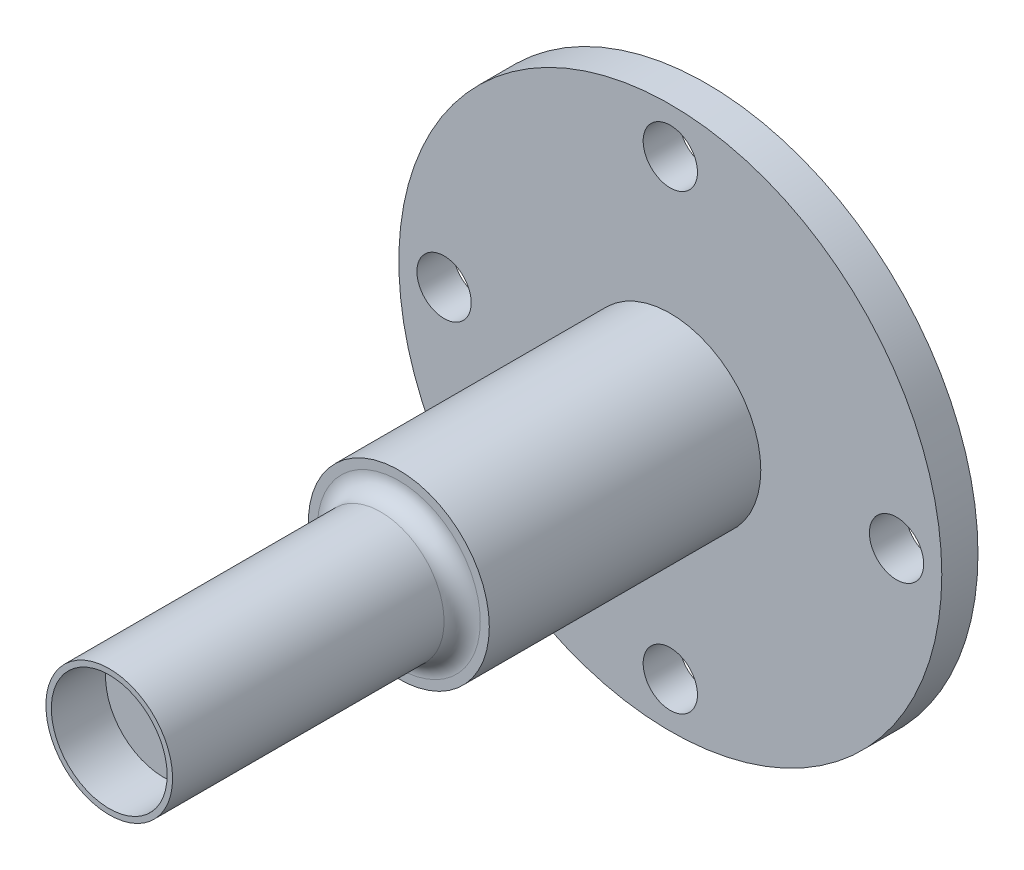
ISO-10303-21;
HEADER;
FILE_DESCRIPTION(('STEP AP214'),'2;1');
FILE_NAME('part.step','',(''),(''),'','','');
FILE_SCHEMA(('AUTOMOTIVE_DESIGN { 1 0 10303 214 1 1 1 1 }'));
ENDSEC;
DATA;
#1=APPLICATION_CONTEXT('core data for automotive mechanical design processes');
#2=APPLICATION_PROTOCOL_DEFINITION('international standard','automotive_design',2000,#1);
#3=PRODUCT_CONTEXT('',#1,'mechanical');
#4=PRODUCT('Part','Part','',(#3));
#5=PRODUCT_RELATED_PRODUCT_CATEGORY('part','',(#4));
#6=PRODUCT_DEFINITION_FORMATION('','',#4);
#7=PRODUCT_DEFINITION_CONTEXT('part definition',#1,'design');
#8=PRODUCT_DEFINITION('design','',#6,#7);
#9=PRODUCT_DEFINITION_SHAPE('','',#8);
#10=(LENGTH_UNIT() NAMED_UNIT(*) SI_UNIT(.MILLI.,.METRE.));
#11=(NAMED_UNIT(*) PLANE_ANGLE_UNIT() SI_UNIT($,.RADIAN.));
#12=(NAMED_UNIT(*) SI_UNIT($,.STERADIAN.) SOLID_ANGLE_UNIT());
#13=UNCERTAINTY_MEASURE_WITH_UNIT(LENGTH_MEASURE(1.E-05),#10,'distance_accuracy_value','');
#14=(GEOMETRIC_REPRESENTATION_CONTEXT(3) GLOBAL_UNCERTAINTY_ASSIGNED_CONTEXT((#13)) GLOBAL_UNIT_ASSIGNED_CONTEXT((#10,
#11,#12)) REPRESENTATION_CONTEXT('',''));
#15=CARTESIAN_POINT('',(0.,0.,0.));
#16=DIRECTION('',(0.,0.,1.));
#17=DIRECTION('',(1.,0.,0.));
#18=AXIS2_PLACEMENT_3D('',#15,#16,#17);
#19=CARTESIAN_POINT('',(-12.5,0.,2.));
#20=DIRECTION('',(0.,0.,-1.));
#21=DIRECTION('',(-1.,0.,0.));
#22=AXIS2_PLACEMENT_3D('',#19,#20,#21);
#23=CYLINDRICAL_SURFACE('',#22,1.5);
#24=CARTESIAN_POINT('',(-12.5,0.,2.));
#25=DIRECTION('',(0.,0.,1.));
#26=DIRECTION('',(1.,0.,0.));
#27=AXIS2_PLACEMENT_3D('',#24,#25,#26);
#28=CIRCLE('',#27,1.5);
#29=CARTESIAN_POINT('',(-11.,0.,2.));
#30=VERTEX_POINT('',#29);
#31=EDGE_CURVE('E83',#30,#30,#28,.T.);
#32=ORIENTED_EDGE('',*,*,#31,.T.);
#33=EDGE_LOOP('',(#32));
#34=FACE_BOUND('',#33,.T.);
#35=CARTESIAN_POINT('',(-12.5,0.,0.));
#36=DIRECTION('',(0.,0.,1.));
#37=DIRECTION('',(1.,0.,0.));
#38=AXIS2_PLACEMENT_3D('',#35,#36,#37);
#39=CIRCLE('',#38,1.5);
#40=CARTESIAN_POINT('',(-11.,0.,0.));
#41=VERTEX_POINT('',#40);
#42=EDGE_CURVE('E65',#41,#41,#39,.T.);
#43=ORIENTED_EDGE('',*,*,#42,.F.);
#44=EDGE_LOOP('',(#43));
#45=FACE_BOUND('',#44,.T.);
#46=ADVANCED_FACE('F43',(#34,#45),#23,.F.);
#47=CARTESIAN_POINT('',(0.,-12.5,2.));
#48=DIRECTION('',(0.,0.,-1.));
#49=DIRECTION('',(-1.,0.,0.));
#50=AXIS2_PLACEMENT_3D('',#47,#48,#49);
#51=CYLINDRICAL_SURFACE('',#50,1.5);
#52=CARTESIAN_POINT('',(0.,-12.5,2.));
#53=DIRECTION('',(0.,0.,1.));
#54=DIRECTION('',(1.,0.,0.));
#55=AXIS2_PLACEMENT_3D('',#52,#53,#54);
#56=CIRCLE('',#55,1.5);
#57=CARTESIAN_POINT('',(1.5,-12.5,2.));
#58=VERTEX_POINT('',#57);
#59=EDGE_CURVE('E86',#58,#58,#56,.T.);
#60=ORIENTED_EDGE('',*,*,#59,.T.);
#61=EDGE_LOOP('',(#60));
#62=FACE_BOUND('',#61,.T.);
#63=CARTESIAN_POINT('',(0.,-12.5,0.));
#64=DIRECTION('',(0.,0.,1.));
#65=DIRECTION('',(1.,0.,0.));
#66=AXIS2_PLACEMENT_3D('',#63,#64,#65);
#67=CIRCLE('',#66,1.5);
#68=CARTESIAN_POINT('',(1.5,-12.5,0.));
#69=VERTEX_POINT('',#68);
#70=EDGE_CURVE('E68',#69,#69,#67,.T.);
#71=ORIENTED_EDGE('',*,*,#70,.F.);
#72=EDGE_LOOP('',(#71));
#73=FACE_BOUND('',#72,.T.);
#74=ADVANCED_FACE('F121',(#62,#73),#51,.F.);
#75=CARTESIAN_POINT('',(12.5,0.,2.));
#76=DIRECTION('',(0.,0.,-1.));
#77=DIRECTION('',(-1.,0.,0.));
#78=AXIS2_PLACEMENT_3D('',#75,#76,#77);
#79=CYLINDRICAL_SURFACE('',#78,1.5);
#80=CARTESIAN_POINT('',(12.5,0.,2.));
#81=DIRECTION('',(0.,0.,1.));
#82=DIRECTION('',(1.,0.,0.));
#83=AXIS2_PLACEMENT_3D('',#80,#81,#82);
#84=CIRCLE('',#83,1.5);
#85=CARTESIAN_POINT('',(14.,0.,2.));
#86=VERTEX_POINT('',#85);
#87=EDGE_CURVE('E89',#86,#86,#84,.T.);
#88=ORIENTED_EDGE('',*,*,#87,.T.);
#89=EDGE_LOOP('',(#88));
#90=FACE_BOUND('',#89,.T.);
#91=CARTESIAN_POINT('',(12.5,0.,0.));
#92=DIRECTION('',(0.,0.,1.));
#93=DIRECTION('',(1.,0.,0.));
#94=AXIS2_PLACEMENT_3D('',#91,#92,#93);
#95=CIRCLE('',#94,1.5);
#96=CARTESIAN_POINT('',(14.,0.,0.));
#97=VERTEX_POINT('',#96);
#98=EDGE_CURVE('E71',#97,#97,#95,.T.);
#99=ORIENTED_EDGE('',*,*,#98,.F.);
#100=EDGE_LOOP('',(#99));
#101=FACE_BOUND('',#100,.T.);
#102=ADVANCED_FACE('F127',(#90,#101),#79,.F.);
#103=CARTESIAN_POINT('',(0.,12.5,2.));
#104=DIRECTION('',(0.,0.,-1.));
#105=DIRECTION('',(-1.,0.,0.));
#106=AXIS2_PLACEMENT_3D('',#103,#104,#105);
#107=CYLINDRICAL_SURFACE('',#106,1.5);
#108=CARTESIAN_POINT('',(0.,12.5,2.));
#109=DIRECTION('',(0.,0.,1.));
#110=DIRECTION('',(1.,0.,0.));
#111=AXIS2_PLACEMENT_3D('',#108,#109,#110);
#112=CIRCLE('',#111,1.5);
#113=CARTESIAN_POINT('',(1.5,12.5,2.));
#114=VERTEX_POINT('',#113);
#115=EDGE_CURVE('E64',#114,#114,#112,.T.);
#116=ORIENTED_EDGE('',*,*,#115,.T.);
#117=EDGE_LOOP('',(#116));
#118=FACE_BOUND('',#117,.T.);
#119=CARTESIAN_POINT('',(0.,12.5,0.));
#120=DIRECTION('',(0.,0.,1.));
#121=DIRECTION('',(1.,0.,0.));
#122=AXIS2_PLACEMENT_3D('',#119,#120,#121);
#123=CIRCLE('',#122,1.5);
#124=CARTESIAN_POINT('',(1.5,12.5,0.));
#125=VERTEX_POINT('',#124);
#126=EDGE_CURVE('E74',#125,#125,#123,.T.);
#127=ORIENTED_EDGE('',*,*,#126,.F.);
#128=EDGE_LOOP('',(#127));
#129=FACE_BOUND('',#128,.T.);
#130=ADVANCED_FACE('F136',(#118,#129),#107,.F.);
#131=CARTESIAN_POINT('',(0.,0.,2.));
#132=DIRECTION('',(0.,0.,-1.));
#133=DIRECTION('',(-1.,0.,0.));
#134=AXIS2_PLACEMENT_3D('',#131,#132,#133);
#135=CYLINDRICAL_SURFACE('',#134,15.);
#136=CARTESIAN_POINT('',(0.,0.,2.));
#137=DIRECTION('',(0.,0.,1.));
#138=DIRECTION('',(1.,0.,0.));
#139=AXIS2_PLACEMENT_3D('',#136,#137,#138);
#140=CIRCLE('',#139,15.);
#141=CARTESIAN_POINT('',(15.,0.,2.));
#142=VERTEX_POINT('',#141);
#143=EDGE_CURVE('E58',#142,#142,#140,.T.);
#144=ORIENTED_EDGE('',*,*,#143,.F.);
#145=EDGE_LOOP('',(#144));
#146=FACE_BOUND('',#145,.T.);
#147=CARTESIAN_POINT('',(0.,0.,0.));
#148=DIRECTION('',(0.,0.,1.));
#149=DIRECTION('',(1.,0.,0.));
#150=AXIS2_PLACEMENT_3D('',#147,#148,#149);
#151=CIRCLE('',#150,15.);
#152=CARTESIAN_POINT('',(15.,0.,0.));
#153=VERTEX_POINT('',#152);
#154=EDGE_CURVE('E61',#153,#153,#151,.T.);
#155=ORIENTED_EDGE('',*,*,#154,.T.);
#156=EDGE_LOOP('',(#155));
#157=FACE_BOUND('',#156,.T.);
#158=ADVANCED_FACE('F132',(#146,#157),#135,.T.);
#159=CARTESIAN_POINT('',(0.,0.,2.));
#160=DIRECTION('',(0.,0.,1.));
#161=DIRECTION('',(1.,0.,0.));
#162=AXIS2_PLACEMENT_3D('',#159,#160,#161);
#163=PLANE('',#162);
#164=ORIENTED_EDGE('',*,*,#115,.F.);
#165=EDGE_LOOP('',(#164));
#166=FACE_BOUND('',#165,.T.);
#167=ORIENTED_EDGE('',*,*,#87,.F.);
#168=EDGE_LOOP('',(#167));
#169=FACE_BOUND('',#168,.T.);
#170=ORIENTED_EDGE('',*,*,#59,.F.);
#171=EDGE_LOOP('',(#170));
#172=FACE_BOUND('',#171,.T.);
#173=ORIENTED_EDGE('',*,*,#31,.F.);
#174=EDGE_LOOP('',(#173));
#175=FACE_BOUND('',#174,.T.);
#176=CARTESIAN_POINT('',(0.,0.,2.));
#177=DIRECTION('',(0.,0.,1.));
#178=DIRECTION('',(1.,0.,0.));
#179=AXIS2_PLACEMENT_3D('',#176,#177,#178);
#180=CIRCLE('',#179,5.);
#181=CARTESIAN_POINT('',(5.,0.,2.));
#182=VERTEX_POINT('',#181);
#183=EDGE_CURVE('E80',#182,#182,#180,.T.);
#184=ORIENTED_EDGE('',*,*,#183,.F.);
#185=EDGE_LOOP('',(#184));
#186=FACE_BOUND('',#185,.T.);
#187=ORIENTED_EDGE('',*,*,#143,.T.);
#188=EDGE_LOOP('',(#187));
#189=FACE_BOUND('',#188,.T.);
#190=ADVANCED_FACE('F143',(#166,#169,#172,#175,#186,#189),#163,.T.);
#191=CARTESIAN_POINT('',(0.,0.,0.));
#192=DIRECTION('',(0.,0.,1.));
#193=DIRECTION('',(1.,0.,0.));
#194=AXIS2_PLACEMENT_3D('',#191,#192,#193);
#195=PLANE('',#194);
#196=ORIENTED_EDGE('',*,*,#126,.T.);
#197=EDGE_LOOP('',(#196));
#198=FACE_BOUND('',#197,.T.);
#199=ORIENTED_EDGE('',*,*,#98,.T.);
#200=EDGE_LOOP('',(#199));
#201=FACE_BOUND('',#200,.T.);
#202=ORIENTED_EDGE('',*,*,#70,.T.);
#203=EDGE_LOOP('',(#202));
#204=FACE_BOUND('',#203,.T.);
#205=ORIENTED_EDGE('',*,*,#42,.T.);
#206=EDGE_LOOP('',(#205));
#207=FACE_BOUND('',#206,.T.);
#208=ORIENTED_EDGE('',*,*,#154,.F.);
#209=EDGE_LOOP('',(#208));
#210=FACE_BOUND('',#209,.T.);
#211=ADVANCED_FACE('F149',(#198,#201,#204,#207,#210),#195,.F.);
#212=CARTESIAN_POINT('',(0.,0.,17.));
#213=DIRECTION('',(0.,0.,-1.));
#214=DIRECTION('',(-1.,0.,0.));
#215=AXIS2_PLACEMENT_3D('',#212,#213,#214);
#216=CYLINDRICAL_SURFACE('',#215,5.);
#217=ORIENTED_EDGE('',*,*,#183,.T.);
#218=EDGE_LOOP('',(#217));
#219=FACE_BOUND('',#218,.T.);
#220=CARTESIAN_POINT('',(0.,0.,17.));
#221=DIRECTION('',(0.,0.,1.));
#222=DIRECTION('',(1.,0.,0.));
#223=AXIS2_PLACEMENT_3D('',#220,#221,#222);
#224=CIRCLE('',#223,5.);
#225=CARTESIAN_POINT('',(5.,0.,17.));
#226=VERTEX_POINT('',#225);
#227=EDGE_CURVE('E77',#226,#226,#224,.T.);
#228=ORIENTED_EDGE('',*,*,#227,.F.);
#229=EDGE_LOOP('',(#228));
#230=FACE_BOUND('',#229,.T.);
#231=ADVANCED_FACE('F117',(#219,#230),#216,.T.);
#232=CARTESIAN_POINT('',(0.,0.,17.));
#233=DIRECTION('',(0.,0.,1.));
#234=DIRECTION('',(1.,0.,0.));
#235=AXIS2_PLACEMENT_3D('',#232,#233,#234);
#236=PLANE('',#235);
#237=CARTESIAN_POINT('',(0.,0.,17.));
#238=DIRECTION('',(0.,0.,1.));
#239=DIRECTION('',(1.,0.,0.));
#240=AXIS2_PLACEMENT_3D('',#237,#238,#239);
#241=CIRCLE('',#240,4.5);
#242=CARTESIAN_POINT('',(4.5,0.,17.));
#243=VERTEX_POINT('',#242);
#244=EDGE_CURVE('E12',#243,#243,#241,.F.);
#245=ORIENTED_EDGE('',*,*,#244,.T.);
#246=EDGE_LOOP('',(#245));
#247=FACE_BOUND('',#246,.T.);
#248=ORIENTED_EDGE('',*,*,#227,.T.);
#249=EDGE_LOOP('',(#248));
#250=FACE_BOUND('',#249,.T.);
#251=ADVANCED_FACE('F109',(#247,#250),#236,.T.);
#252=CARTESIAN_POINT('',(0.,0.,33.));
#253=DIRECTION('',(0.,0.,1.));
#254=DIRECTION('',(1.,0.,0.));
#255=AXIS2_PLACEMENT_3D('',#252,#253,#254);
#256=PLANE('',#255);
#257=CARTESIAN_POINT('',(0.,0.,33.));
#258=DIRECTION('',(0.,0.,1.));
#259=DIRECTION('',(1.,0.,0.));
#260=AXIS2_PLACEMENT_3D('',#257,#258,#259);
#261=CIRCLE('',#260,3.5);
#262=CARTESIAN_POINT('',(3.5,0.,33.));
#263=VERTEX_POINT('',#262);
#264=EDGE_CURVE('E96',#263,#263,#261,.T.);
#265=ORIENTED_EDGE('',*,*,#264,.T.);
#266=EDGE_LOOP('',(#265));
#267=FACE_BOUND('',#266,.T.);
#268=CARTESIAN_POINT('',(0.,0.,33.));
#269=DIRECTION('',(0.,0.,1.));
#270=DIRECTION('',(1.,0.,0.));
#271=AXIS2_PLACEMENT_3D('',#268,#269,#270);
#272=CIRCLE('',#271,3.2);
#273=CARTESIAN_POINT('',(3.2,0.,33.));
#274=VERTEX_POINT('',#273);
#275=EDGE_CURVE('E100',#274,#274,#272,.T.);
#276=ORIENTED_EDGE('',*,*,#275,.F.);
#277=EDGE_LOOP('',(#276));
#278=FACE_BOUND('',#277,.T.);
#279=ADVANCED_FACE('F106',(#267,#278),#256,.T.);
#280=CARTESIAN_POINT('',(0.,0.,33.));
#281=DIRECTION('',(0.,0.,-1.));
#282=DIRECTION('',(-1.,0.,0.));
#283=AXIS2_PLACEMENT_3D('',#280,#281,#282);
#284=CYLINDRICAL_SURFACE('',#283,3.5);
#285=CARTESIAN_POINT('',(0.,0.,18.));
#286=DIRECTION('',(0.,0.,1.));
#287=DIRECTION('',(1.,0.,0.));
#288=AXIS2_PLACEMENT_3D('',#285,#286,#287);
#289=CIRCLE('',#288,3.5);
#290=CARTESIAN_POINT('',(3.5,0.,18.));
#291=VERTEX_POINT('',#290);
#292=EDGE_CURVE('E50',#291,#291,#289,.T.);
#293=ORIENTED_EDGE('',*,*,#292,.T.);
#294=EDGE_LOOP('',(#293));
#295=FACE_BOUND('',#294,.T.);
#296=ORIENTED_EDGE('',*,*,#264,.F.);
#297=EDGE_LOOP('',(#296));
#298=FACE_BOUND('',#297,.T.);
#299=ADVANCED_FACE('F108',(#295,#298),#284,.T.);
#300=CARTESIAN_POINT('',(0.,0.,33.));
#301=DIRECTION('',(0.,0.,-1.));
#302=DIRECTION('',(-1.,0.,0.));
#303=AXIS2_PLACEMENT_3D('',#300,#301,#302);
#304=CYLINDRICAL_SURFACE('',#303,3.2);
#305=CARTESIAN_POINT('',(0.,0.,30.));
#306=DIRECTION('',(0.,0.,1.));
#307=DIRECTION('',(1.,0.,0.));
#308=AXIS2_PLACEMENT_3D('',#305,#306,#307);
#309=CIRCLE('',#308,3.2);
#310=CARTESIAN_POINT('',(3.2,0.,30.));
#311=VERTEX_POINT('',#310);
#312=EDGE_CURVE('E54',#311,#311,#309,.T.);
#313=ORIENTED_EDGE('',*,*,#312,.F.);
#314=EDGE_LOOP('',(#313));
#315=FACE_BOUND('',#314,.T.);
#316=ORIENTED_EDGE('',*,*,#275,.T.);
#317=EDGE_LOOP('',(#316));
#318=FACE_BOUND('',#317,.T.);
#319=ADVANCED_FACE('F104',(#315,#318),#304,.F.);
#320=CARTESIAN_POINT('',(0.,0.,30.));
#321=DIRECTION('',(0.,0.,1.));
#322=DIRECTION('',(1.,0.,0.));
#323=AXIS2_PLACEMENT_3D('',#320,#321,#322);
#324=PLANE('',#323);
#325=ORIENTED_EDGE('',*,*,#312,.T.);
#326=EDGE_LOOP('',(#325));
#327=FACE_BOUND('',#326,.T.);
#328=ADVANCED_FACE('F249',(#327),#324,.T.);
#329=CARTESIAN_POINT('',(0.,0.,18.));
#330=DIRECTION('',(0.,0.,1.));
#331=DIRECTION('',(1.,0.,0.));
#332=AXIS2_PLACEMENT_3D('',#329,#330,#331);
#333=TOROIDAL_SURFACE('',#332,4.5,1.);
#334=ORIENTED_EDGE('',*,*,#244,.F.);
#335=EDGE_LOOP('',(#334));
#336=FACE_BOUND('',#335,.T.);
#337=ORIENTED_EDGE('',*,*,#292,.F.);
#338=EDGE_LOOP('',(#337));
#339=FACE_BOUND('',#338,.T.);
#340=ADVANCED_FACE('F45',(#336,#339),#333,.F.);
#341=CLOSED_SHELL('',(#46,#74,#102,#130,#158,#190,#211,#231,#251,#279,#299,#319,#328,#340));
#342=MANIFOLD_SOLID_BREP('B2',#341);
#343=ADVANCED_BREP_SHAPE_REPRESENTATION('',(#18,#342),#14);
#344=SHAPE_DEFINITION_REPRESENTATION(#9,#343);
ENDSEC;
END-ISO-10303-21;
